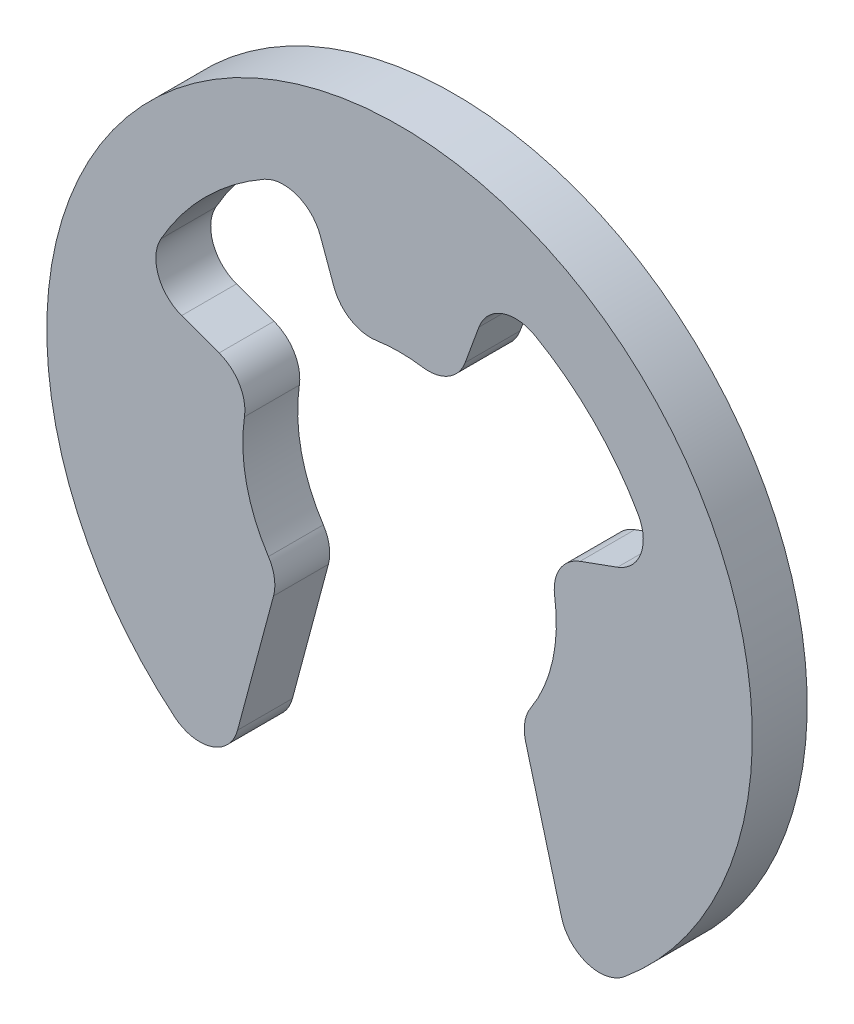
ISO-10303-21;
HEADER;
FILE_DESCRIPTION(('STEP AP214'),'2;1');
FILE_NAME('part.step','',(''),(''),'','','');
FILE_SCHEMA(('AUTOMOTIVE_DESIGN { 1 0 10303 214 1 1 1 1 }'));
ENDSEC;
DATA;
#1=APPLICATION_CONTEXT('core data for automotive mechanical design processes');
#2=APPLICATION_PROTOCOL_DEFINITION('international standard','automotive_design',2000,#1);
#3=PRODUCT_CONTEXT('',#1,'mechanical');
#4=PRODUCT('Part','Part','',(#3));
#5=PRODUCT_RELATED_PRODUCT_CATEGORY('part','',(#4));
#6=PRODUCT_DEFINITION_FORMATION('','',#4);
#7=PRODUCT_DEFINITION_CONTEXT('part definition',#1,'design');
#8=PRODUCT_DEFINITION('design','',#6,#7);
#9=PRODUCT_DEFINITION_SHAPE('','',#8);
#10=(LENGTH_UNIT() NAMED_UNIT(*) SI_UNIT(.MILLI.,.METRE.));
#11=(NAMED_UNIT(*) PLANE_ANGLE_UNIT() SI_UNIT($,.RADIAN.));
#12=(NAMED_UNIT(*) SI_UNIT($,.STERADIAN.) SOLID_ANGLE_UNIT());
#13=UNCERTAINTY_MEASURE_WITH_UNIT(LENGTH_MEASURE(1.E-05),#10,'distance_accuracy_value','');
#14=(GEOMETRIC_REPRESENTATION_CONTEXT(3) GLOBAL_UNCERTAINTY_ASSIGNED_CONTEXT((#13)) GLOBAL_UNIT_ASSIGNED_CONTEXT((#10,
#11,#12)) REPRESENTATION_CONTEXT('',''));
#15=CARTESIAN_POINT('',(0.,0.,0.));
#16=DIRECTION('',(0.,0.,1.));
#17=DIRECTION('',(1.,0.,0.));
#18=AXIS2_PLACEMENT_3D('',#15,#16,#17);
#19=CARTESIAN_POINT('',(-2.549325229221,-3.0823596278918,0.7));
#20=DIRECTION('',(0.,0.,-1.));
#21=DIRECTION('',(-1.,0.,0.));
#22=AXIS2_PLACEMENT_3D('',#19,#20,#21);
#23=CYLINDRICAL_SURFACE('',#22,0.5);
#24=CARTESIAN_POINT('',(-2.549325229221,-3.0823596278918,0.));
#25=DIRECTION('',(0.,0.,1.));
#26=DIRECTION('',(-1.,0.,0.));
#27=AXIS2_PLACEMENT_3D('',#24,#25,#26);
#28=CIRCLE('',#27,0.5);
#29=CARTESIAN_POINT('',(-2.86799088287363,-3.46765458137827,0.));
#30=VERTEX_POINT('',#29);
#31=CARTESIAN_POINT('',(-2.06636231607647,-3.21176915044306,0.));
#32=VERTEX_POINT('',#31);
#33=EDGE_CURVE('E197',#30,#32,#28,.T.);
#34=ORIENTED_EDGE('',*,*,#33,.T.);
#35=DIRECTION('',(0.,0.,-1.));
#36=VECTOR('',#35,1.);
#37=CARTESIAN_POINT('',(-2.06636231607647,-3.21176915044306,0.7));
#38=LINE('',#37,#36);
#39=CARTESIAN_POINT('',(-2.06636231607647,-3.21176915044306,0.7));
#40=VERTEX_POINT('',#39);
#41=EDGE_CURVE('E11',#40,#32,#38,.T.);
#42=ORIENTED_EDGE('',*,*,#41,.F.);
#43=CARTESIAN_POINT('',(-2.549325229221,-3.0823596278918,0.7));
#44=DIRECTION('',(0.,0.,1.));
#45=DIRECTION('',(-1.,0.,0.));
#46=AXIS2_PLACEMENT_3D('',#43,#44,#45);
#47=CIRCLE('',#46,0.5);
#48=CARTESIAN_POINT('',(-2.86799088287363,-3.46765458137827,0.7));
#49=VERTEX_POINT('',#48);
#50=EDGE_CURVE('E256',#49,#40,#47,.T.);
#51=ORIENTED_EDGE('',*,*,#50,.F.);
#52=DIRECTION('',(0.,0.,-1.));
#53=VECTOR('',#52,1.);
#54=CARTESIAN_POINT('',(-2.86799088287363,-3.46765458137827,0.7));
#55=LINE('',#54,#53);
#56=EDGE_CURVE('E210',#49,#30,#55,.T.);
#57=ORIENTED_EDGE('',*,*,#56,.T.);
#58=EDGE_LOOP('',(#34,#42,#51,#57));
#59=FACE_BOUND('',#58,.T.);
#60=ADVANCED_FACE('F33',(#59),#23,.T.);
#61=CARTESIAN_POINT('',(-1.607738908291,-1.50016329104732,0.7));
#62=DIRECTION('',(-0.965925826289068,0.258819045102521,0.));
#63=DIRECTION('',(-0.258819045102521,-0.965925826289068,0.));
#64=AXIS2_PLACEMENT_3D('',#61,#62,#63);
#65=PLANE('',#64);
#66=DIRECTION('',(0.258819045102521,0.965925826289068,0.));
#67=VECTOR('',#66,1.);
#68=CARTESIAN_POINT('',(-1.607738908291,-1.50016329104732,0.));
#69=LINE('',#68,#67);
#70=CARTESIAN_POINT('',(-1.607738908291,-1.50016329104732,0.));
#71=VERTEX_POINT('',#70);
#72=EDGE_CURVE('E193',#32,#71,#69,.T.);
#73=ORIENTED_EDGE('',*,*,#72,.T.);
#74=DIRECTION('',(0.,0.,-1.));
#75=VECTOR('',#74,1.);
#76=CARTESIAN_POINT('',(-1.607738908291,-1.50016329104732,0.7));
#77=LINE('',#76,#75);
#78=CARTESIAN_POINT('',(-1.607738908291,-1.50016329104732,0.7));
#79=VERTEX_POINT('',#78);
#80=EDGE_CURVE('E40',#79,#71,#77,.T.);
#81=ORIENTED_EDGE('',*,*,#80,.F.);
#82=DIRECTION('',(0.258819045102521,0.965925826289068,0.));
#83=VECTOR('',#82,1.);
#84=CARTESIAN_POINT('',(-1.607738908291,-1.50016329104732,0.7));
#85=LINE('',#84,#83);
#86=EDGE_CURVE('E206',#40,#79,#85,.T.);
#87=ORIENTED_EDGE('',*,*,#86,.F.);
#88=ORIENTED_EDGE('',*,*,#41,.T.);
#89=EDGE_LOOP('',(#73,#81,#87,#88));
#90=FACE_BOUND('',#89,.T.);
#91=ADVANCED_FACE('F205',(#90),#65,.F.);
#92=CARTESIAN_POINT('',(-2.09070182143553,-1.37075376849606,0.7));
#93=DIRECTION('',(0.,0.,-1.));
#94=DIRECTION('',(-1.,0.,0.));
#95=AXIS2_PLACEMENT_3D('',#92,#93,#94);
#96=CYLINDRICAL_SURFACE('',#95,0.5);
#97=CARTESIAN_POINT('',(-2.09070182143553,-1.37075376849606,0.));
#98=DIRECTION('',(0.,0.,1.));
#99=DIRECTION('',(-1.,0.,0.));
#100=AXIS2_PLACEMENT_3D('',#97,#98,#99);
#101=CIRCLE('',#100,0.5);
#102=CARTESIAN_POINT('',(-1.67256145714843,-1.09660301479685,0.));
#103=VERTEX_POINT('',#102);
#104=EDGE_CURVE('E199',#71,#103,#101,.T.);
#105=ORIENTED_EDGE('',*,*,#104,.T.);
#106=DIRECTION('',(0.,0.,-1.));
#107=VECTOR('',#106,1.);
#108=CARTESIAN_POINT('',(-1.67256145714843,-1.09660301479685,0.7));
#109=LINE('',#108,#107);
#110=CARTESIAN_POINT('',(-1.67256145714843,-1.09660301479685,0.7));
#111=VERTEX_POINT('',#110);
#112=EDGE_CURVE('E362',#111,#103,#109,.T.);
#113=ORIENTED_EDGE('',*,*,#112,.F.);
#114=CARTESIAN_POINT('',(-2.09070182143553,-1.37075376849606,0.7));
#115=DIRECTION('',(0.,0.,1.));
#116=DIRECTION('',(-1.,0.,0.));
#117=AXIS2_PLACEMENT_3D('',#114,#115,#116);
#118=CIRCLE('',#117,0.5);
#119=EDGE_CURVE('E259',#79,#111,#118,.T.);
#120=ORIENTED_EDGE('',*,*,#119,.F.);
#121=ORIENTED_EDGE('',*,*,#80,.T.);
#122=EDGE_LOOP('',(#105,#113,#120,#121));
#123=FACE_BOUND('',#122,.T.);
#124=ADVANCED_FACE('F366',(#123),#96,.T.);
#125=CARTESIAN_POINT('',(0.,0.,0.7));
#126=DIRECTION('',(0.,0.,-1.));
#127=DIRECTION('',(-1.,0.,0.));
#128=AXIS2_PLACEMENT_3D('',#125,#126,#127);
#129=CYLINDRICAL_SURFACE('',#128,2.);
#130=CARTESIAN_POINT('',(0.,0.,0.));
#131=DIRECTION('',(0.,0.,-1.));
#132=DIRECTION('',(1.,0.,0.));
#133=AXIS2_PLACEMENT_3D('',#130,#131,#132);
#134=CIRCLE('',#133,2.);
#135=CARTESIAN_POINT('',(-1.97822200611757,0.294342818006803,0.));
#136=VERTEX_POINT('',#135);
#137=EDGE_CURVE('E214',#103,#136,#134,.T.);
#138=ORIENTED_EDGE('',*,*,#137,.T.);
#139=DIRECTION('',(0.,0.,-1.));
#140=VECTOR('',#139,1.);
#141=CARTESIAN_POINT('',(-1.97822200611757,0.294342818006803,0.7));
#142=LINE('',#141,#140);
#143=CARTESIAN_POINT('',(-1.97822200611757,0.294342818006803,0.7));
#144=VERTEX_POINT('',#143);
#145=EDGE_CURVE('E359',#144,#136,#142,.T.);
#146=ORIENTED_EDGE('',*,*,#145,.F.);
#147=CARTESIAN_POINT('',(0.,0.,0.7));
#148=DIRECTION('',(0.,0.,-1.));
#149=DIRECTION('',(1.,0.,0.));
#150=AXIS2_PLACEMENT_3D('',#147,#148,#149);
#151=CIRCLE('',#150,2.);
#152=EDGE_CURVE('E261',#111,#144,#151,.T.);
#153=ORIENTED_EDGE('',*,*,#152,.F.);
#154=ORIENTED_EDGE('',*,*,#112,.T.);
#155=EDGE_LOOP('',(#138,#146,#153,#154));
#156=FACE_BOUND('',#155,.T.);
#157=ADVANCED_FACE('F374',(#156),#129,.F.);
#158=CARTESIAN_POINT('',(-2.47277750764696,0.367928522508504,0.7));
#159=DIRECTION('',(0.,0.,-1.));
#160=DIRECTION('',(-1.,0.,0.));
#161=AXIS2_PLACEMENT_3D('',#158,#159,#160);
#162=CYLINDRICAL_SURFACE('',#161,0.5);
#163=CARTESIAN_POINT('',(-2.47277750764696,0.367928522508504,0.));
#164=DIRECTION('',(0.,0.,1.));
#165=DIRECTION('',(-1.,0.,0.));
#166=AXIS2_PLACEMENT_3D('',#163,#164,#165);
#167=CIRCLE('',#166,0.5);
#168=CARTESIAN_POINT('',(-2.30176743598413,0.837774832901458,0.));
#169=VERTEX_POINT('',#168);
#170=EDGE_CURVE('E216',#136,#169,#167,.T.);
#171=ORIENTED_EDGE('',*,*,#170,.T.);
#172=DIRECTION('',(0.,0.,-1.));
#173=VECTOR('',#172,1.);
#174=CARTESIAN_POINT('',(-2.30176743598413,0.837774832901458,0.7));
#175=LINE('',#174,#173);
#176=CARTESIAN_POINT('',(-2.30176743598413,0.837774832901458,0.7));
#177=VERTEX_POINT('',#176);
#178=EDGE_CURVE('E356',#177,#169,#175,.T.);
#179=ORIENTED_EDGE('',*,*,#178,.F.);
#180=CARTESIAN_POINT('',(-2.47277750764696,0.367928522508504,0.7));
#181=DIRECTION('',(0.,0.,1.));
#182=DIRECTION('',(-1.,0.,0.));
#183=AXIS2_PLACEMENT_3D('',#180,#181,#182);
#184=CIRCLE('',#183,0.5);
#185=EDGE_CURVE('E263',#144,#177,#184,.T.);
#186=ORIENTED_EDGE('',*,*,#185,.F.);
#187=ORIENTED_EDGE('',*,*,#145,.T.);
#188=EDGE_LOOP('',(#171,#179,#186,#187));
#189=FACE_BOUND('',#188,.T.);
#190=ADVANCED_FACE('F377',(#189),#162,.T.);
#191=CARTESIAN_POINT('',(-2.30176743598413,0.837774832901458,0.7));
#192=DIRECTION('',(-0.342020143325669,-0.939692620785908,0.));
#193=DIRECTION('',(0.939692620785908,-0.342020143325669,0.));
#194=AXIS2_PLACEMENT_3D('',#191,#192,#193);
#195=PLANE('',#194);
#196=DIRECTION('',(-0.939692620785908,0.342020143325669,0.));
#197=VECTOR('',#196,1.);
#198=CARTESIAN_POINT('',(-2.30176743598413,0.837774832901458,0.));
#199=LINE('',#198,#197);
#200=CARTESIAN_POINT('',(-2.7796482580797,1.01170922767091,0.));
#201=VERTEX_POINT('',#200);
#202=EDGE_CURVE('E218',#169,#201,#199,.T.);
#203=ORIENTED_EDGE('',*,*,#202,.T.);
#204=DIRECTION('',(0.,0.,-1.));
#205=VECTOR('',#204,1.);
#206=CARTESIAN_POINT('',(-2.7796482580797,1.01170922767091,0.7));
#207=LINE('',#206,#205);
#208=CARTESIAN_POINT('',(-2.7796482580797,1.01170922767091,0.7));
#209=VERTEX_POINT('',#208);
#210=EDGE_CURVE('E353',#209,#201,#207,.T.);
#211=ORIENTED_EDGE('',*,*,#210,.F.);
#212=DIRECTION('',(-0.939692620785908,0.342020143325669,0.));
#213=VECTOR('',#212,1.);
#214=CARTESIAN_POINT('',(-2.30176743598413,0.837774832901458,0.7));
#215=LINE('',#214,#213);
#216=EDGE_CURVE('E265',#177,#209,#215,.T.);
#217=ORIENTED_EDGE('',*,*,#216,.F.);
#218=ORIENTED_EDGE('',*,*,#178,.T.);
#219=EDGE_LOOP('',(#203,#211,#217,#218));
#220=FACE_BOUND('',#219,.T.);
#221=ADVANCED_FACE('F382',(#220),#195,.F.);
#222=CARTESIAN_POINT('',(-2.60863818641687,1.48155553806387,0.7));
#223=DIRECTION('',(0.,0.,-1.));
#224=DIRECTION('',(-1.,0.,0.));
#225=AXIS2_PLACEMENT_3D('',#222,#223,#224);
#226=CYLINDRICAL_SURFACE('',#225,0.5);
#227=CARTESIAN_POINT('',(-2.60863818641687,1.48155553806387,0.));
#228=DIRECTION('',(0.,0.,-1.));
#229=DIRECTION('',(1.,0.,0.));
#230=AXIS2_PLACEMENT_3D('',#227,#228,#229);
#231=CIRCLE('',#230,0.5);
#232=CARTESIAN_POINT('',(-3.04341121748635,1.72848146107451,0.));
#233=VERTEX_POINT('',#232);
#234=EDGE_CURVE('E220',#201,#233,#231,.T.);
#235=ORIENTED_EDGE('',*,*,#234,.T.);
#236=DIRECTION('',(0.,0.,-1.));
#237=VECTOR('',#236,1.);
#238=CARTESIAN_POINT('',(-3.04341121748635,1.72848146107451,0.7));
#239=LINE('',#238,#237);
#240=CARTESIAN_POINT('',(-3.04341121748635,1.72848146107451,0.7));
#241=VERTEX_POINT('',#240);
#242=EDGE_CURVE('E350',#241,#233,#239,.T.);
#243=ORIENTED_EDGE('',*,*,#242,.F.);
#244=CARTESIAN_POINT('',(-2.60863818641687,1.48155553806387,0.7));
#245=DIRECTION('',(0.,0.,-1.));
#246=DIRECTION('',(1.,0.,0.));
#247=AXIS2_PLACEMENT_3D('',#244,#245,#246);
#248=CIRCLE('',#247,0.5);
#249=EDGE_CURVE('E267',#209,#241,#248,.T.);
#250=ORIENTED_EDGE('',*,*,#249,.F.);
#251=ORIENTED_EDGE('',*,*,#210,.T.);
#252=EDGE_LOOP('',(#235,#243,#250,#251));
#253=FACE_BOUND('',#252,.T.);
#254=ADVANCED_FACE('F388',(#253),#226,.F.);
#255=CARTESIAN_POINT('',(0.,0.,0.7));
#256=DIRECTION('',(0.,0.,-1.));
#257=DIRECTION('',(-1.,0.,0.));
#258=AXIS2_PLACEMENT_3D('',#255,#256,#257);
#259=CYLINDRICAL_SURFACE('',#258,3.5);
#260=CARTESIAN_POINT('',(0.,0.,0.));
#261=DIRECTION('',(0.,0.,-1.));
#262=DIRECTION('',(-1.,0.,0.));
#263=AXIS2_PLACEMENT_3D('',#260,#261,#262);
#264=CIRCLE('',#263,3.5);
#265=CARTESIAN_POINT('',(-1.7284814610745,3.04341121748635,0.));
#266=VERTEX_POINT('',#265);
#267=EDGE_CURVE('E222',#233,#266,#264,.T.);
#268=ORIENTED_EDGE('',*,*,#267,.T.);
#269=DIRECTION('',(0.,0.,-1.));
#270=VECTOR('',#269,1.);
#271=CARTESIAN_POINT('',(-1.7284814610745,3.04341121748635,0.7));
#272=LINE('',#271,#270);
#273=CARTESIAN_POINT('',(-1.7284814610745,3.04341121748635,0.7));
#274=VERTEX_POINT('',#273);
#275=EDGE_CURVE('E347',#274,#266,#272,.T.);
#276=ORIENTED_EDGE('',*,*,#275,.F.);
#277=CARTESIAN_POINT('',(0.,0.,0.7));
#278=DIRECTION('',(0.,0.,-1.));
#279=DIRECTION('',(-1.,0.,0.));
#280=AXIS2_PLACEMENT_3D('',#277,#278,#279);
#281=CIRCLE('',#280,3.5);
#282=EDGE_CURVE('E269',#241,#274,#281,.T.);
#283=ORIENTED_EDGE('',*,*,#282,.F.);
#284=ORIENTED_EDGE('',*,*,#242,.T.);
#285=EDGE_LOOP('',(#268,#276,#283,#284));
#286=FACE_BOUND('',#285,.T.);
#287=ADVANCED_FACE('F392',(#286),#259,.F.);
#288=CARTESIAN_POINT('',(-1.48155553806386,2.60863818641687,0.7));
#289=DIRECTION('',(0.,0.,-1.));
#290=DIRECTION('',(-1.,0.,0.));
#291=AXIS2_PLACEMENT_3D('',#288,#289,#290);
#292=CYLINDRICAL_SURFACE('',#291,0.5);
#293=CARTESIAN_POINT('',(-1.48155553806386,2.60863818641687,0.));
#294=DIRECTION('',(0.,0.,-1.));
#295=DIRECTION('',(1.,0.,0.));
#296=AXIS2_PLACEMENT_3D('',#293,#294,#295);
#297=CIRCLE('',#296,0.5);
#298=CARTESIAN_POINT('',(-1.0117092276709,2.77964825807971,0.));
#299=VERTEX_POINT('',#298);
#300=EDGE_CURVE('E224',#266,#299,#297,.T.);
#301=ORIENTED_EDGE('',*,*,#300,.T.);
#302=DIRECTION('',(0.,0.,-1.));
#303=VECTOR('',#302,1.);
#304=CARTESIAN_POINT('',(-1.0117092276709,2.77964825807971,0.7));
#305=LINE('',#304,#303);
#306=CARTESIAN_POINT('',(-1.0117092276709,2.77964825807971,0.7));
#307=VERTEX_POINT('',#306);
#308=EDGE_CURVE('E344',#307,#299,#305,.T.);
#309=ORIENTED_EDGE('',*,*,#308,.F.);
#310=CARTESIAN_POINT('',(-1.48155553806386,2.60863818641687,0.7));
#311=DIRECTION('',(0.,0.,-1.));
#312=DIRECTION('',(1.,0.,0.));
#313=AXIS2_PLACEMENT_3D('',#310,#311,#312);
#314=CIRCLE('',#313,0.5);
#315=EDGE_CURVE('E271',#274,#307,#314,.T.);
#316=ORIENTED_EDGE('',*,*,#315,.F.);
#317=ORIENTED_EDGE('',*,*,#275,.T.);
#318=EDGE_LOOP('',(#301,#309,#316,#317));
#319=FACE_BOUND('',#318,.T.);
#320=ADVANCED_FACE('F397',(#319),#292,.F.);
#321=CARTESIAN_POINT('',(-0.83777483290145,2.30176743598413,0.7));
#322=DIRECTION('',(0.939692620785909,0.342020143325666,0.));
#323=DIRECTION('',(-0.342020143325666,0.93969262078591,0.));
#324=AXIS2_PLACEMENT_3D('',#321,#322,#323);
#325=PLANE('',#324);
#326=DIRECTION('',(0.342020143325666,-0.93969262078591,0.));
#327=VECTOR('',#326,1.);
#328=CARTESIAN_POINT('',(-0.83777483290145,2.30176743598413,0.));
#329=LINE('',#328,#327);
#330=CARTESIAN_POINT('',(-0.83777483290145,2.30176743598413,0.));
#331=VERTEX_POINT('',#330);
#332=EDGE_CURVE('E226',#299,#331,#329,.T.);
#333=ORIENTED_EDGE('',*,*,#332,.T.);
#334=DIRECTION('',(0.,0.,-1.));
#335=VECTOR('',#334,1.);
#336=CARTESIAN_POINT('',(-0.83777483290145,2.30176743598413,0.7));
#337=LINE('',#336,#335);
#338=CARTESIAN_POINT('',(-0.83777483290145,2.30176743598413,0.7));
#339=VERTEX_POINT('',#338);
#340=EDGE_CURVE('E341',#339,#331,#337,.T.);
#341=ORIENTED_EDGE('',*,*,#340,.F.);
#342=DIRECTION('',(0.342020143325666,-0.93969262078591,0.));
#343=VECTOR('',#342,1.);
#344=CARTESIAN_POINT('',(-0.83777483290145,2.30176743598413,0.7));
#345=LINE('',#344,#343);
#346=EDGE_CURVE('E273',#307,#339,#345,.T.);
#347=ORIENTED_EDGE('',*,*,#346,.F.);
#348=ORIENTED_EDGE('',*,*,#308,.T.);
#349=EDGE_LOOP('',(#333,#341,#347,#348));
#350=FACE_BOUND('',#349,.T.);
#351=ADVANCED_FACE('F403',(#350),#325,.F.);
#352=CARTESIAN_POINT('',(-0.367928522508495,2.47277750764696,0.7));
#353=DIRECTION('',(0.,0.,-1.));
#354=DIRECTION('',(-1.,0.,0.));
#355=AXIS2_PLACEMENT_3D('',#352,#353,#354);
#356=CYLINDRICAL_SURFACE('',#355,0.5);
#357=CARTESIAN_POINT('',(-0.367928522508495,2.47277750764696,0.));
#358=DIRECTION('',(0.,0.,1.));
#359=DIRECTION('',(-1.,0.,0.));
#360=AXIS2_PLACEMENT_3D('',#357,#358,#359);
#361=CIRCLE('',#360,0.5);
#362=CARTESIAN_POINT('',(-0.294342818006796,1.97822200611757,0.));
#363=VERTEX_POINT('',#362);
#364=EDGE_CURVE('E228',#331,#363,#361,.T.);
#365=ORIENTED_EDGE('',*,*,#364,.T.);
#366=DIRECTION('',(0.,0.,-1.));
#367=VECTOR('',#366,1.);
#368=CARTESIAN_POINT('',(-0.294342818006796,1.97822200611757,0.7));
#369=LINE('',#368,#367);
#370=CARTESIAN_POINT('',(-0.294342818006796,1.97822200611757,0.7));
#371=VERTEX_POINT('',#370);
#372=EDGE_CURVE('E338',#371,#363,#369,.T.);
#373=ORIENTED_EDGE('',*,*,#372,.F.);
#374=CARTESIAN_POINT('',(-0.367928522508495,2.47277750764696,0.7));
#375=DIRECTION('',(0.,0.,1.));
#376=DIRECTION('',(-1.,0.,0.));
#377=AXIS2_PLACEMENT_3D('',#374,#375,#376);
#378=CIRCLE('',#377,0.5);
#379=EDGE_CURVE('E275',#339,#371,#378,.T.);
#380=ORIENTED_EDGE('',*,*,#379,.F.);
#381=ORIENTED_EDGE('',*,*,#340,.T.);
#382=EDGE_LOOP('',(#365,#373,#380,#381));
#383=FACE_BOUND('',#382,.T.);
#384=ADVANCED_FACE('F407',(#383),#356,.T.);
#385=CARTESIAN_POINT('',(0.,0.,0.7));
#386=DIRECTION('',(0.,0.,-1.));
#387=DIRECTION('',(-1.,0.,0.));
#388=AXIS2_PLACEMENT_3D('',#385,#386,#387);
#389=CYLINDRICAL_SURFACE('',#388,2.);
#390=CARTESIAN_POINT('',(0.,0.,0.));
#391=DIRECTION('',(0.,0.,-1.));
#392=DIRECTION('',(1.,0.,0.));
#393=AXIS2_PLACEMENT_3D('',#390,#391,#392);
#394=CIRCLE('',#393,2.);
#395=CARTESIAN_POINT('',(0.294342818006796,1.97822200611757,0.));
#396=VERTEX_POINT('',#395);
#397=EDGE_CURVE('E230',#363,#396,#394,.T.);
#398=ORIENTED_EDGE('',*,*,#397,.T.);
#399=DIRECTION('',(0.,0.,-1.));
#400=VECTOR('',#399,1.);
#401=CARTESIAN_POINT('',(0.294342818006796,1.97822200611757,0.7));
#402=LINE('',#401,#400);
#403=CARTESIAN_POINT('',(0.294342818006796,1.97822200611757,0.7));
#404=VERTEX_POINT('',#403);
#405=EDGE_CURVE('E335',#404,#396,#402,.T.);
#406=ORIENTED_EDGE('',*,*,#405,.F.);
#407=CARTESIAN_POINT('',(0.,0.,0.7));
#408=DIRECTION('',(0.,0.,-1.));
#409=DIRECTION('',(1.,0.,0.));
#410=AXIS2_PLACEMENT_3D('',#407,#408,#409);
#411=CIRCLE('',#410,2.);
#412=EDGE_CURVE('E277',#371,#404,#411,.T.);
#413=ORIENTED_EDGE('',*,*,#412,.F.);
#414=ORIENTED_EDGE('',*,*,#372,.T.);
#415=EDGE_LOOP('',(#398,#406,#413,#414));
#416=FACE_BOUND('',#415,.T.);
#417=ADVANCED_FACE('F412',(#416),#389,.F.);
#418=CARTESIAN_POINT('',(0.367928522508495,2.47277750764696,0.7));
#419=DIRECTION('',(0.,0.,-1.));
#420=DIRECTION('',(-1.,0.,0.));
#421=AXIS2_PLACEMENT_3D('',#418,#419,#420);
#422=CYLINDRICAL_SURFACE('',#421,0.5);
#423=CARTESIAN_POINT('',(0.367928522508495,2.47277750764696,0.));
#424=DIRECTION('',(0.,0.,1.));
#425=DIRECTION('',(-1.,0.,0.));
#426=AXIS2_PLACEMENT_3D('',#423,#424,#425);
#427=CIRCLE('',#426,0.5);
#428=CARTESIAN_POINT('',(0.83777483290145,2.30176743598413,0.));
#429=VERTEX_POINT('',#428);
#430=EDGE_CURVE('E232',#396,#429,#427,.T.);
#431=ORIENTED_EDGE('',*,*,#430,.T.);
#432=DIRECTION('',(0.,0.,-1.));
#433=VECTOR('',#432,1.);
#434=CARTESIAN_POINT('',(0.83777483290145,2.30176743598413,0.7));
#435=LINE('',#434,#433);
#436=CARTESIAN_POINT('',(0.83777483290145,2.30176743598413,0.7));
#437=VERTEX_POINT('',#436);
#438=EDGE_CURVE('E332',#437,#429,#435,.T.);
#439=ORIENTED_EDGE('',*,*,#438,.F.);
#440=CARTESIAN_POINT('',(0.367928522508495,2.47277750764696,0.7));
#441=DIRECTION('',(0.,0.,1.));
#442=DIRECTION('',(-1.,0.,0.));
#443=AXIS2_PLACEMENT_3D('',#440,#441,#442);
#444=CIRCLE('',#443,0.5);
#445=EDGE_CURVE('E279',#404,#437,#444,.T.);
#446=ORIENTED_EDGE('',*,*,#445,.F.);
#447=ORIENTED_EDGE('',*,*,#405,.T.);
#448=EDGE_LOOP('',(#431,#439,#446,#447));
#449=FACE_BOUND('',#448,.T.);
#450=ADVANCED_FACE('F418',(#449),#422,.T.);
#451=CARTESIAN_POINT('',(0.837774832901449,2.30176743598413,0.7));
#452=DIRECTION('',(-0.93969262078591,0.342020143325665,0.));
#453=DIRECTION('',(-0.342020143325665,-0.93969262078591,0.));
#454=AXIS2_PLACEMENT_3D('',#451,#452,#453);
#455=PLANE('',#454);
#456=DIRECTION('',(0.342020143325665,0.93969262078591,0.));
#457=VECTOR('',#456,1.);
#458=CARTESIAN_POINT('',(0.837774832901449,2.30176743598413,0.));
#459=LINE('',#458,#457);
#460=CARTESIAN_POINT('',(1.0117092276709,2.77964825807971,0.));
#461=VERTEX_POINT('',#460);
#462=EDGE_CURVE('E234',#429,#461,#459,.T.);
#463=ORIENTED_EDGE('',*,*,#462,.T.);
#464=DIRECTION('',(0.,0.,-1.));
#465=VECTOR('',#464,1.);
#466=CARTESIAN_POINT('',(1.0117092276709,2.77964825807971,0.7));
#467=LINE('',#466,#465);
#468=CARTESIAN_POINT('',(1.0117092276709,2.77964825807971,0.7));
#469=VERTEX_POINT('',#468);
#470=EDGE_CURVE('E329',#469,#461,#467,.T.);
#471=ORIENTED_EDGE('',*,*,#470,.F.);
#472=DIRECTION('',(0.342020143325665,0.93969262078591,0.));
#473=VECTOR('',#472,1.);
#474=CARTESIAN_POINT('',(0.837774832901449,2.30176743598413,0.7));
#475=LINE('',#474,#473);
#476=EDGE_CURVE('E281',#437,#469,#475,.T.);
#477=ORIENTED_EDGE('',*,*,#476,.F.);
#478=ORIENTED_EDGE('',*,*,#438,.T.);
#479=EDGE_LOOP('',(#463,#471,#477,#478));
#480=FACE_BOUND('',#479,.T.);
#481=ADVANCED_FACE('F422',(#480),#455,.F.);
#482=CARTESIAN_POINT('',(1.48155553806386,2.60863818641687,0.7));
#483=DIRECTION('',(0.,0.,-1.));
#484=DIRECTION('',(-1.,0.,0.));
#485=AXIS2_PLACEMENT_3D('',#482,#483,#484);
#486=CYLINDRICAL_SURFACE('',#485,0.5);
#487=CARTESIAN_POINT('',(1.48155553806386,2.60863818641687,0.));
#488=DIRECTION('',(0.,0.,-1.));
#489=DIRECTION('',(1.,0.,0.));
#490=AXIS2_PLACEMENT_3D('',#487,#488,#489);
#491=CIRCLE('',#490,0.5);
#492=CARTESIAN_POINT('',(1.7284814610745,3.04341121748635,0.));
#493=VERTEX_POINT('',#492);
#494=EDGE_CURVE('E236',#461,#493,#491,.T.);
#495=ORIENTED_EDGE('',*,*,#494,.T.);
#496=DIRECTION('',(0.,0.,-1.));
#497=VECTOR('',#496,1.);
#498=CARTESIAN_POINT('',(1.7284814610745,3.04341121748635,0.7));
#499=LINE('',#498,#497);
#500=CARTESIAN_POINT('',(1.7284814610745,3.04341121748635,0.7));
#501=VERTEX_POINT('',#500);
#502=EDGE_CURVE('E326',#501,#493,#499,.T.);
#503=ORIENTED_EDGE('',*,*,#502,.F.);
#504=CARTESIAN_POINT('',(1.48155553806386,2.60863818641687,0.7));
#505=DIRECTION('',(0.,0.,-1.));
#506=DIRECTION('',(1.,0.,0.));
#507=AXIS2_PLACEMENT_3D('',#504,#505,#506);
#508=CIRCLE('',#507,0.5);
#509=EDGE_CURVE('E283',#469,#501,#508,.T.);
#510=ORIENTED_EDGE('',*,*,#509,.F.);
#511=ORIENTED_EDGE('',*,*,#470,.T.);
#512=EDGE_LOOP('',(#495,#503,#510,#511));
#513=FACE_BOUND('',#512,.T.);
#514=ADVANCED_FACE('F427',(#513),#486,.F.);
#515=CARTESIAN_POINT('',(0.,0.,0.7));
#516=DIRECTION('',(0.,0.,-1.));
#517=DIRECTION('',(-1.,0.,0.));
#518=AXIS2_PLACEMENT_3D('',#515,#516,#517);
#519=CYLINDRICAL_SURFACE('',#518,3.5);
#520=CARTESIAN_POINT('',(0.,0.,0.));
#521=DIRECTION('',(0.,0.,-1.));
#522=DIRECTION('',(1.,0.,0.));
#523=AXIS2_PLACEMENT_3D('',#520,#521,#522);
#524=CIRCLE('',#523,3.5);
#525=CARTESIAN_POINT('',(3.04341121748635,1.72848146107451,0.));
#526=VERTEX_POINT('',#525);
#527=EDGE_CURVE('E238',#493,#526,#524,.T.);
#528=ORIENTED_EDGE('',*,*,#527,.T.);
#529=DIRECTION('',(0.,0.,-1.));
#530=VECTOR('',#529,1.);
#531=CARTESIAN_POINT('',(3.04341121748635,1.72848146107451,0.7));
#532=LINE('',#531,#530);
#533=CARTESIAN_POINT('',(3.04341121748635,1.72848146107451,0.7));
#534=VERTEX_POINT('',#533);
#535=EDGE_CURVE('E323',#534,#526,#532,.T.);
#536=ORIENTED_EDGE('',*,*,#535,.F.);
#537=CARTESIAN_POINT('',(0.,0.,0.7));
#538=DIRECTION('',(0.,0.,-1.));
#539=DIRECTION('',(1.,0.,0.));
#540=AXIS2_PLACEMENT_3D('',#537,#538,#539);
#541=CIRCLE('',#540,3.5);
#542=EDGE_CURVE('E285',#501,#534,#541,.T.);
#543=ORIENTED_EDGE('',*,*,#542,.F.);
#544=ORIENTED_EDGE('',*,*,#502,.T.);
#545=EDGE_LOOP('',(#528,#536,#543,#544));
#546=FACE_BOUND('',#545,.T.);
#547=ADVANCED_FACE('F433',(#546),#519,.F.);
#548=CARTESIAN_POINT('',(2.60863818641687,1.48155553806387,0.7));
#549=DIRECTION('',(0.,0.,-1.));
#550=DIRECTION('',(-1.,0.,0.));
#551=AXIS2_PLACEMENT_3D('',#548,#549,#550);
#552=CYLINDRICAL_SURFACE('',#551,0.5);
#553=CARTESIAN_POINT('',(2.60863818641687,1.48155553806387,0.));
#554=DIRECTION('',(0.,0.,-1.));
#555=DIRECTION('',(1.,0.,0.));
#556=AXIS2_PLACEMENT_3D('',#553,#554,#555);
#557=CIRCLE('',#556,0.5);
#558=CARTESIAN_POINT('',(2.7796482580797,1.01170922767091,0.));
#559=VERTEX_POINT('',#558);
#560=EDGE_CURVE('E240',#526,#559,#557,.T.);
#561=ORIENTED_EDGE('',*,*,#560,.T.);
#562=DIRECTION('',(0.,0.,-1.));
#563=VECTOR('',#562,1.);
#564=CARTESIAN_POINT('',(2.7796482580797,1.01170922767091,0.7));
#565=LINE('',#564,#563);
#566=CARTESIAN_POINT('',(2.7796482580797,1.01170922767091,0.7));
#567=VERTEX_POINT('',#566);
#568=EDGE_CURVE('E320',#567,#559,#565,.T.);
#569=ORIENTED_EDGE('',*,*,#568,.F.);
#570=CARTESIAN_POINT('',(2.60863818641687,1.48155553806387,0.7));
#571=DIRECTION('',(0.,0.,-1.));
#572=DIRECTION('',(1.,0.,0.));
#573=AXIS2_PLACEMENT_3D('',#570,#571,#572);
#574=CIRCLE('',#573,0.5);
#575=EDGE_CURVE('E287',#534,#567,#574,.T.);
#576=ORIENTED_EDGE('',*,*,#575,.F.);
#577=ORIENTED_EDGE('',*,*,#535,.T.);
#578=EDGE_LOOP('',(#561,#569,#576,#577));
#579=FACE_BOUND('',#578,.T.);
#580=ADVANCED_FACE('F437',(#579),#552,.F.);
#581=CARTESIAN_POINT('',(2.30176743598413,0.837774832901459,0.7));
#582=DIRECTION('',(0.342020143325669,-0.939692620785908,0.));
#583=DIRECTION('',(0.939692620785908,0.342020143325669,0.));
#584=AXIS2_PLACEMENT_3D('',#581,#582,#583);
#585=PLANE('',#584);
#586=DIRECTION('',(-0.939692620785908,-0.342020143325669,0.));
#587=VECTOR('',#586,1.);
#588=CARTESIAN_POINT('',(2.30176743598413,0.837774832901459,0.));
#589=LINE('',#588,#587);
#590=CARTESIAN_POINT('',(2.30176743598413,0.837774832901459,0.));
#591=VERTEX_POINT('',#590);
#592=EDGE_CURVE('E242',#559,#591,#589,.T.);
#593=ORIENTED_EDGE('',*,*,#592,.T.);
#594=DIRECTION('',(0.,0.,-1.));
#595=VECTOR('',#594,1.);
#596=CARTESIAN_POINT('',(2.30176743598413,0.837774832901459,0.7));
#597=LINE('',#596,#595);
#598=CARTESIAN_POINT('',(2.30176743598413,0.837774832901459,0.7));
#599=VERTEX_POINT('',#598);
#600=EDGE_CURVE('E317',#599,#591,#597,.T.);
#601=ORIENTED_EDGE('',*,*,#600,.F.);
#602=DIRECTION('',(-0.939692620785908,-0.342020143325669,0.));
#603=VECTOR('',#602,1.);
#604=CARTESIAN_POINT('',(2.30176743598413,0.837774832901459,0.7));
#605=LINE('',#604,#603);
#606=EDGE_CURVE('E289',#567,#599,#605,.T.);
#607=ORIENTED_EDGE('',*,*,#606,.F.);
#608=ORIENTED_EDGE('',*,*,#568,.T.);
#609=EDGE_LOOP('',(#593,#601,#607,#608));
#610=FACE_BOUND('',#609,.T.);
#611=ADVANCED_FACE('F442',(#610),#585,.F.);
#612=CARTESIAN_POINT('',(2.47277750764696,0.367928522508505,0.7));
#613=DIRECTION('',(0.,0.,-1.));
#614=DIRECTION('',(-1.,0.,0.));
#615=AXIS2_PLACEMENT_3D('',#612,#613,#614);
#616=CYLINDRICAL_SURFACE('',#615,0.5);
#617=CARTESIAN_POINT('',(2.47277750764696,0.367928522508505,0.));
#618=DIRECTION('',(0.,0.,1.));
#619=DIRECTION('',(-1.,0.,0.));
#620=AXIS2_PLACEMENT_3D('',#617,#618,#619);
#621=CIRCLE('',#620,0.5);
#622=CARTESIAN_POINT('',(1.97822200611757,0.294342818006804,0.));
#623=VERTEX_POINT('',#622);
#624=EDGE_CURVE('E244',#591,#623,#621,.T.);
#625=ORIENTED_EDGE('',*,*,#624,.T.);
#626=DIRECTION('',(0.,0.,-1.));
#627=VECTOR('',#626,1.);
#628=CARTESIAN_POINT('',(1.97822200611757,0.294342818006804,0.7));
#629=LINE('',#628,#627);
#630=CARTESIAN_POINT('',(1.97822200611757,0.294342818006804,0.7));
#631=VERTEX_POINT('',#630);
#632=EDGE_CURVE('E314',#631,#623,#629,.T.);
#633=ORIENTED_EDGE('',*,*,#632,.F.);
#634=CARTESIAN_POINT('',(2.47277750764696,0.367928522508505,0.7));
#635=DIRECTION('',(0.,0.,1.));
#636=DIRECTION('',(-1.,0.,0.));
#637=AXIS2_PLACEMENT_3D('',#634,#635,#636);
#638=CIRCLE('',#637,0.5);
#639=EDGE_CURVE('E291',#599,#631,#638,.T.);
#640=ORIENTED_EDGE('',*,*,#639,.F.);
#641=ORIENTED_EDGE('',*,*,#600,.T.);
#642=EDGE_LOOP('',(#625,#633,#640,#641));
#643=FACE_BOUND('',#642,.T.);
#644=ADVANCED_FACE('F448',(#643),#616,.T.);
#645=CARTESIAN_POINT('',(0.,0.,0.7));
#646=DIRECTION('',(0.,0.,-1.));
#647=DIRECTION('',(-1.,0.,0.));
#648=AXIS2_PLACEMENT_3D('',#645,#646,#647);
#649=CYLINDRICAL_SURFACE('',#648,2.);
#650=CARTESIAN_POINT('',(0.,0.,0.));
#651=DIRECTION('',(0.,0.,-1.));
#652=DIRECTION('',(1.,0.,0.));
#653=AXIS2_PLACEMENT_3D('',#650,#651,#652);
#654=CIRCLE('',#653,2.);
#655=CARTESIAN_POINT('',(1.67256145714843,-1.09660301479684,0.));
#656=VERTEX_POINT('',#655);
#657=EDGE_CURVE('E246',#623,#656,#654,.T.);
#658=ORIENTED_EDGE('',*,*,#657,.T.);
#659=DIRECTION('',(0.,0.,-1.));
#660=VECTOR('',#659,1.);
#661=CARTESIAN_POINT('',(1.67256145714843,-1.09660301479684,0.7));
#662=LINE('',#661,#660);
#663=CARTESIAN_POINT('',(1.67256145714843,-1.09660301479684,0.7));
#664=VERTEX_POINT('',#663);
#665=EDGE_CURVE('E311',#664,#656,#662,.T.);
#666=ORIENTED_EDGE('',*,*,#665,.F.);
#667=CARTESIAN_POINT('',(0.,0.,0.7));
#668=DIRECTION('',(0.,0.,-1.));
#669=DIRECTION('',(1.,0.,0.));
#670=AXIS2_PLACEMENT_3D('',#667,#668,#669);
#671=CIRCLE('',#670,2.);
#672=EDGE_CURVE('E293',#631,#664,#671,.T.);
#673=ORIENTED_EDGE('',*,*,#672,.F.);
#674=ORIENTED_EDGE('',*,*,#632,.T.);
#675=EDGE_LOOP('',(#658,#666,#673,#674));
#676=FACE_BOUND('',#675,.T.);
#677=ADVANCED_FACE('F452',(#676),#649,.F.);
#678=CARTESIAN_POINT('',(2.09070182143553,-1.37075376849606,0.7));
#679=DIRECTION('',(0.,0.,-1.));
#680=DIRECTION('',(-1.,0.,0.));
#681=AXIS2_PLACEMENT_3D('',#678,#679,#680);
#682=CYLINDRICAL_SURFACE('',#681,0.5);
#683=CARTESIAN_POINT('',(2.09070182143553,-1.37075376849606,0.));
#684=DIRECTION('',(0.,0.,1.));
#685=DIRECTION('',(-1.,0.,0.));
#686=AXIS2_PLACEMENT_3D('',#683,#684,#685);
#687=CIRCLE('',#686,0.5);
#688=CARTESIAN_POINT('',(1.607738908291,-1.50016329104732,0.));
#689=VERTEX_POINT('',#688);
#690=EDGE_CURVE('E248',#656,#689,#687,.T.);
#691=ORIENTED_EDGE('',*,*,#690,.T.);
#692=DIRECTION('',(0.,0.,-1.));
#693=VECTOR('',#692,1.);
#694=CARTESIAN_POINT('',(1.607738908291,-1.50016329104732,0.7));
#695=LINE('',#694,#693);
#696=CARTESIAN_POINT('',(1.607738908291,-1.50016329104732,0.7));
#697=VERTEX_POINT('',#696);
#698=EDGE_CURVE('E308',#697,#689,#695,.T.);
#699=ORIENTED_EDGE('',*,*,#698,.F.);
#700=CARTESIAN_POINT('',(2.09070182143553,-1.37075376849606,0.7));
#701=DIRECTION('',(0.,0.,1.));
#702=DIRECTION('',(-1.,0.,0.));
#703=AXIS2_PLACEMENT_3D('',#700,#701,#702);
#704=CIRCLE('',#703,0.5);
#705=EDGE_CURVE('E295',#664,#697,#704,.T.);
#706=ORIENTED_EDGE('',*,*,#705,.F.);
#707=ORIENTED_EDGE('',*,*,#665,.T.);
#708=EDGE_LOOP('',(#691,#699,#706,#707));
#709=FACE_BOUND('',#708,.T.);
#710=ADVANCED_FACE('F457',(#709),#682,.T.);
#711=CARTESIAN_POINT('',(1.607738908291,-1.50016329104732,0.7));
#712=DIRECTION('',(0.965925826289068,0.258819045102522,0.));
#713=DIRECTION('',(-0.258819045102522,0.965925826289068,0.));
#714=AXIS2_PLACEMENT_3D('',#711,#712,#713);
#715=PLANE('',#714);
#716=DIRECTION('',(0.258819045102522,-0.965925826289068,0.));
#717=VECTOR('',#716,1.);
#718=CARTESIAN_POINT('',(1.607738908291,-1.50016329104732,0.));
#719=LINE('',#718,#717);
#720=CARTESIAN_POINT('',(2.06636231607647,-3.21176915044306,0.));
#721=VERTEX_POINT('',#720);
#722=EDGE_CURVE('E250',#689,#721,#719,.T.);
#723=ORIENTED_EDGE('',*,*,#722,.T.);
#724=DIRECTION('',(0.,0.,-1.));
#725=VECTOR('',#724,1.);
#726=CARTESIAN_POINT('',(2.06636231607647,-3.21176915044306,0.7));
#727=LINE('',#726,#725);
#728=CARTESIAN_POINT('',(2.06636231607647,-3.21176915044306,0.7));
#729=VERTEX_POINT('',#728);
#730=EDGE_CURVE('E305',#729,#721,#727,.T.);
#731=ORIENTED_EDGE('',*,*,#730,.F.);
#732=DIRECTION('',(0.258819045102522,-0.965925826289068,0.));
#733=VECTOR('',#732,1.);
#734=CARTESIAN_POINT('',(1.607738908291,-1.50016329104732,0.7));
#735=LINE('',#734,#733);
#736=EDGE_CURVE('E297',#697,#729,#735,.T.);
#737=ORIENTED_EDGE('',*,*,#736,.F.);
#738=ORIENTED_EDGE('',*,*,#698,.T.);
#739=EDGE_LOOP('',(#723,#731,#737,#738));
#740=FACE_BOUND('',#739,.T.);
#741=ADVANCED_FACE('F461',(#740),#715,.F.);
#742=CARTESIAN_POINT('',(2.549325229221,-3.0823596278918,0.7));
#743=DIRECTION('',(0.,0.,-1.));
#744=DIRECTION('',(-1.,0.,0.));
#745=AXIS2_PLACEMENT_3D('',#742,#743,#744);
#746=CYLINDRICAL_SURFACE('',#745,0.5);
#747=CARTESIAN_POINT('',(2.549325229221,-3.0823596278918,0.));
#748=DIRECTION('',(0.,0.,1.));
#749=DIRECTION('',(-1.,0.,0.));
#750=AXIS2_PLACEMENT_3D('',#747,#748,#749);
#751=CIRCLE('',#750,0.5);
#752=CARTESIAN_POINT('',(2.86799088287363,-3.46765458137827,0.));
#753=VERTEX_POINT('',#752);
#754=EDGE_CURVE('E252',#721,#753,#751,.T.);
#755=ORIENTED_EDGE('',*,*,#754,.T.);
#756=DIRECTION('',(0.,0.,-1.));
#757=VECTOR('',#756,1.);
#758=CARTESIAN_POINT('',(2.86799088287363,-3.46765458137827,0.7));
#759=LINE('',#758,#757);
#760=CARTESIAN_POINT('',(2.86799088287363,-3.46765458137827,0.7));
#761=VERTEX_POINT('',#760);
#762=EDGE_CURVE('E302',#761,#753,#759,.T.);
#763=ORIENTED_EDGE('',*,*,#762,.F.);
#764=CARTESIAN_POINT('',(2.549325229221,-3.0823596278918,0.7));
#765=DIRECTION('',(0.,0.,1.));
#766=DIRECTION('',(-1.,0.,0.));
#767=AXIS2_PLACEMENT_3D('',#764,#765,#766);
#768=CIRCLE('',#767,0.5);
#769=EDGE_CURVE('E52',#729,#761,#768,.T.);
#770=ORIENTED_EDGE('',*,*,#769,.F.);
#771=ORIENTED_EDGE('',*,*,#730,.T.);
#772=EDGE_LOOP('',(#755,#763,#770,#771));
#773=FACE_BOUND('',#772,.T.);
#774=ADVANCED_FACE('F465',(#773),#746,.T.);
#775=CARTESIAN_POINT('',(0.,0.,0.7));
#776=DIRECTION('',(0.,0.,-1.));
#777=DIRECTION('',(-1.,0.,0.));
#778=AXIS2_PLACEMENT_3D('',#775,#776,#777);
#779=CYLINDRICAL_SURFACE('',#778,4.5);
#780=CARTESIAN_POINT('',(0.,0.,0.));
#781=DIRECTION('',(0.,0.,1.));
#782=DIRECTION('',(1.,0.,0.));
#783=AXIS2_PLACEMENT_3D('',#780,#781,#782);
#784=CIRCLE('',#783,4.5);
#785=EDGE_CURVE('E254',#753,#30,#784,.T.);
#786=ORIENTED_EDGE('',*,*,#785,.T.);
#787=ORIENTED_EDGE('',*,*,#56,.F.);
#788=CARTESIAN_POINT('',(0.,0.,0.7));
#789=DIRECTION('',(0.,0.,1.));
#790=DIRECTION('',(1.,0.,0.));
#791=AXIS2_PLACEMENT_3D('',#788,#789,#790);
#792=CIRCLE('',#791,4.5);
#793=EDGE_CURVE('E47',#761,#49,#792,.T.);
#794=ORIENTED_EDGE('',*,*,#793,.F.);
#795=ORIENTED_EDGE('',*,*,#762,.T.);
#796=EDGE_LOOP('',(#786,#787,#794,#795));
#797=FACE_BOUND('',#796,.T.);
#798=ADVANCED_FACE('F467',(#797),#779,.T.);
#799=CARTESIAN_POINT('',(-2.549325229221,-3.0823596278918,0.7));
#800=DIRECTION('',(0.,0.,-1.));
#801=DIRECTION('',(-1.,0.,0.));
#802=AXIS2_PLACEMENT_3D('',#799,#800,#801);
#803=PLANE('',#802);
#804=ORIENTED_EDGE('',*,*,#50,.T.);
#805=ORIENTED_EDGE('',*,*,#86,.T.);
#806=ORIENTED_EDGE('',*,*,#119,.T.);
#807=ORIENTED_EDGE('',*,*,#152,.T.);
#808=ORIENTED_EDGE('',*,*,#185,.T.);
#809=ORIENTED_EDGE('',*,*,#216,.T.);
#810=ORIENTED_EDGE('',*,*,#249,.T.);
#811=ORIENTED_EDGE('',*,*,#282,.T.);
#812=ORIENTED_EDGE('',*,*,#315,.T.);
#813=ORIENTED_EDGE('',*,*,#346,.T.);
#814=ORIENTED_EDGE('',*,*,#379,.T.);
#815=ORIENTED_EDGE('',*,*,#412,.T.);
#816=ORIENTED_EDGE('',*,*,#445,.T.);
#817=ORIENTED_EDGE('',*,*,#476,.T.);
#818=ORIENTED_EDGE('',*,*,#509,.T.);
#819=ORIENTED_EDGE('',*,*,#542,.T.);
#820=ORIENTED_EDGE('',*,*,#575,.T.);
#821=ORIENTED_EDGE('',*,*,#606,.T.);
#822=ORIENTED_EDGE('',*,*,#639,.T.);
#823=ORIENTED_EDGE('',*,*,#672,.T.);
#824=ORIENTED_EDGE('',*,*,#705,.T.);
#825=ORIENTED_EDGE('',*,*,#736,.T.);
#826=ORIENTED_EDGE('',*,*,#769,.T.);
#827=ORIENTED_EDGE('',*,*,#793,.T.);
#828=EDGE_LOOP('',(#804,#805,#806,#807,#808,#809,#810,#811,#812,#813,#814,#815,#816,#817,#818,
#819,#820,#821,#822,#823,#824,#825,#826,#827));
#829=FACE_BOUND('',#828,.T.);
#830=ADVANCED_FACE('F369',(#829),#803,.F.);
#831=CARTESIAN_POINT('',(-2.549325229221,-3.0823596278918,0.));
#832=DIRECTION('',(0.,0.,-1.));
#833=DIRECTION('',(-1.,0.,0.));
#834=AXIS2_PLACEMENT_3D('',#831,#832,#833);
#835=PLANE('',#834);
#836=ORIENTED_EDGE('',*,*,#33,.F.);
#837=ORIENTED_EDGE('',*,*,#785,.F.);
#838=ORIENTED_EDGE('',*,*,#754,.F.);
#839=ORIENTED_EDGE('',*,*,#722,.F.);
#840=ORIENTED_EDGE('',*,*,#690,.F.);
#841=ORIENTED_EDGE('',*,*,#657,.F.);
#842=ORIENTED_EDGE('',*,*,#624,.F.);
#843=ORIENTED_EDGE('',*,*,#592,.F.);
#844=ORIENTED_EDGE('',*,*,#560,.F.);
#845=ORIENTED_EDGE('',*,*,#527,.F.);
#846=ORIENTED_EDGE('',*,*,#494,.F.);
#847=ORIENTED_EDGE('',*,*,#462,.F.);
#848=ORIENTED_EDGE('',*,*,#430,.F.);
#849=ORIENTED_EDGE('',*,*,#397,.F.);
#850=ORIENTED_EDGE('',*,*,#364,.F.);
#851=ORIENTED_EDGE('',*,*,#332,.F.);
#852=ORIENTED_EDGE('',*,*,#300,.F.);
#853=ORIENTED_EDGE('',*,*,#267,.F.);
#854=ORIENTED_EDGE('',*,*,#234,.F.);
#855=ORIENTED_EDGE('',*,*,#202,.F.);
#856=ORIENTED_EDGE('',*,*,#170,.F.);
#857=ORIENTED_EDGE('',*,*,#137,.F.);
#858=ORIENTED_EDGE('',*,*,#104,.F.);
#859=ORIENTED_EDGE('',*,*,#72,.F.);
#860=EDGE_LOOP('',(#836,#837,#838,#839,#840,#841,#842,#843,#844,#845,#846,#847,#848,#849,#850,
#851,#852,#853,#854,#855,#856,#857,#858,#859));
#861=FACE_BOUND('',#860,.T.);
#862=ADVANCED_FACE('F194',(#861),#835,.T.);
#863=CLOSED_SHELL('',(#60,#91,#124,#157,#190,#221,#254,#287,#320,#351,#384,#417,#450,#481,#514,
#547,#580,#611,#644,#677,#710,#741,#774,#798,#830,#862));
#864=MANIFOLD_SOLID_BREP('B2',#863);
#865=ADVANCED_BREP_SHAPE_REPRESENTATION('',(#18,#864),#14);
#866=SHAPE_DEFINITION_REPRESENTATION(#9,#865);
ENDSEC;
END-ISO-10303-21;
